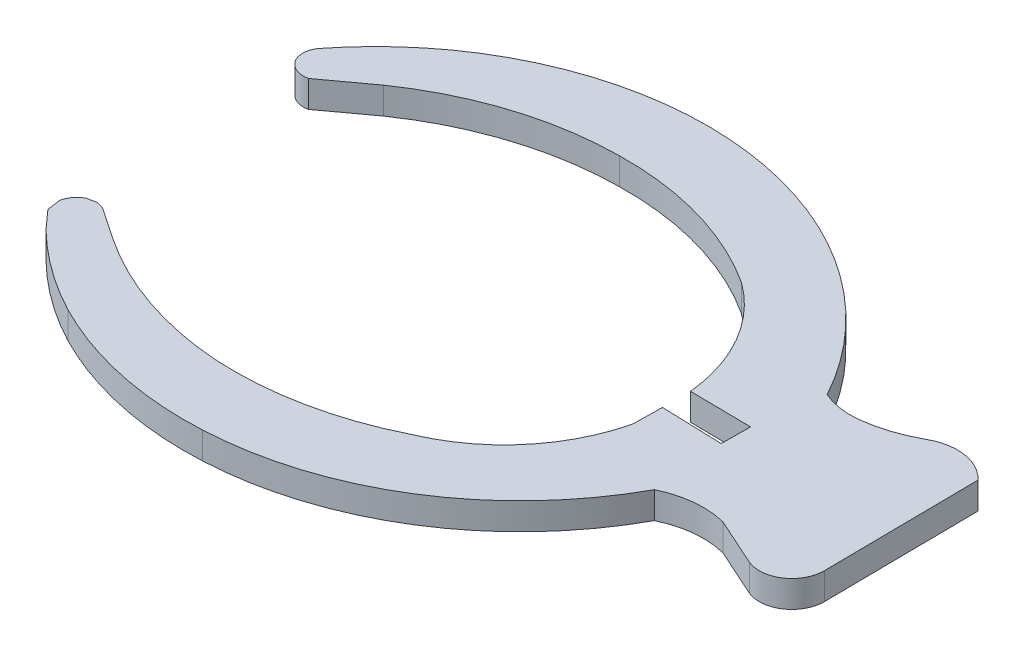
ISO-10303-21;
HEADER;
FILE_DESCRIPTION(('STEP AP214'),'2;1');
FILE_NAME('part.step','',(''),(''),'','','');
FILE_SCHEMA(('AUTOMOTIVE_DESIGN { 1 0 10303 214 1 1 1 1 }'));
ENDSEC;
DATA;
#1=APPLICATION_CONTEXT('core data for automotive mechanical design processes');
#2=APPLICATION_PROTOCOL_DEFINITION('international standard','automotive_design',2000,#1);
#3=PRODUCT_CONTEXT('',#1,'mechanical');
#4=PRODUCT('Part','Part','',(#3));
#5=PRODUCT_RELATED_PRODUCT_CATEGORY('part','',(#4));
#6=PRODUCT_DEFINITION_FORMATION('','',#4);
#7=PRODUCT_DEFINITION_CONTEXT('part definition',#1,'design');
#8=PRODUCT_DEFINITION('design','',#6,#7);
#9=PRODUCT_DEFINITION_SHAPE('','',#8);
#10=(LENGTH_UNIT() NAMED_UNIT(*) SI_UNIT(.MILLI.,.METRE.));
#11=(NAMED_UNIT(*) PLANE_ANGLE_UNIT() SI_UNIT($,.RADIAN.));
#12=(NAMED_UNIT(*) SI_UNIT($,.STERADIAN.) SOLID_ANGLE_UNIT());
#13=UNCERTAINTY_MEASURE_WITH_UNIT(LENGTH_MEASURE(1.E-05),#10,'distance_accuracy_value','');
#14=(GEOMETRIC_REPRESENTATION_CONTEXT(3) GLOBAL_UNCERTAINTY_ASSIGNED_CONTEXT((#13)) GLOBAL_UNIT_ASSIGNED_CONTEXT((#10,
#11,#12)) REPRESENTATION_CONTEXT('',''));
#15=CARTESIAN_POINT('',(0.,0.,0.));
#16=DIRECTION('',(0.,0.,1.));
#17=DIRECTION('',(1.,0.,0.));
#18=AXIS2_PLACEMENT_3D('',#15,#16,#17);
#19=CARTESIAN_POINT('',(-51.9580999999603,3.,14.1540000000221));
#20=DIRECTION('',(0.999847434216621,0.,0.0174673492677126));
#21=DIRECTION('',(0.0174673492677126,0.,-0.999847434216621));
#22=AXIS2_PLACEMENT_3D('',#19,#20,#21);
#23=PLANE('',#22);
#24=DIRECTION('',(-0.0174673492677126,0.,0.999847434216621));
#25=VECTOR('',#24,1.);
#26=CARTESIAN_POINT('',(-51.9580999999603,0.,14.1540000000221));
#27=LINE('',#26,#25);
#28=CARTESIAN_POINT('',(-51.90045,0.,10.85406));
#29=VERTEX_POINT('',#28);
#30=CARTESIAN_POINT('',(-51.9580999999603,0.,14.1540000000221));
#31=VERTEX_POINT('',#30);
#32=EDGE_CURVE('E275',#29,#31,#27,.T.);
#33=ORIENTED_EDGE('',*,*,#32,.T.);
#34=DIRECTION('',(0.,-1.,0.));
#35=VECTOR('',#34,1.);
#36=CARTESIAN_POINT('',(-51.9580999999603,3.,14.1540000000221));
#37=LINE('',#36,#35);
#38=CARTESIAN_POINT('',(-51.9580999999603,3.,14.1540000000221));
#39=VERTEX_POINT('',#38);
#40=EDGE_CURVE('E11',#39,#31,#37,.T.);
#41=ORIENTED_EDGE('',*,*,#40,.F.);
#42=DIRECTION('',(-0.0174673492677126,0.,0.999847434216621));
#43=VECTOR('',#42,1.);
#44=CARTESIAN_POINT('',(-51.9580999999603,3.,14.1540000000221));
#45=LINE('',#44,#43);
#46=CARTESIAN_POINT('',(-51.90045,3.,10.85406));
#47=VERTEX_POINT('',#46);
#48=EDGE_CURVE('E337',#47,#39,#45,.T.);
#49=ORIENTED_EDGE('',*,*,#48,.F.);
#50=DIRECTION('',(0.,-1.,0.));
#51=VECTOR('',#50,1.);
#52=CARTESIAN_POINT('',(-51.90045,3.,10.85406));
#53=LINE('',#52,#51);
#54=EDGE_CURVE('E271',#47,#29,#53,.T.);
#55=ORIENTED_EDGE('',*,*,#54,.T.);
#56=EDGE_LOOP('',(#33,#41,#49,#55));
#57=FACE_BOUND('',#56,.T.);
#58=ADVANCED_FACE('F35',(#57),#23,.F.);
#59=CARTESIAN_POINT('',(-70.9004116450741,3.,9.54715193339373));
#60=DIRECTION('',(0.,-1.,0.));
#61=DIRECTION('',(0.,0.,-1.));
#62=AXIS2_PLACEMENT_3D('',#59,#60,#61);
#63=CYLINDRICAL_SURFACE('',#62,19.4944663833);
#64=CARTESIAN_POINT('',(-70.9004116450741,0.,9.54715193339373));
#65=DIRECTION('',(0.,-1.,0.));
#66=DIRECTION('',(0.,0.,1.));
#67=AXIS2_PLACEMENT_3D('',#64,#65,#66);
#68=CIRCLE('',#67,19.4944663833);
#69=CARTESIAN_POINT('',(-63.3197400000056,0.,27.5073199999589));
#70=VERTEX_POINT('',#69);
#71=EDGE_CURVE('E278',#31,#70,#68,.T.);
#72=ORIENTED_EDGE('',*,*,#71,.T.);
#73=DIRECTION('',(0.,-1.,0.));
#74=VECTOR('',#73,1.);
#75=CARTESIAN_POINT('',(-63.3197400000056,3.,27.5073199999589));
#76=LINE('',#75,#74);
#77=CARTESIAN_POINT('',(-63.3197400000056,3.,27.5073199999589));
#78=VERTEX_POINT('',#77);
#79=EDGE_CURVE('E43',#78,#70,#76,.T.);
#80=ORIENTED_EDGE('',*,*,#79,.F.);
#81=CARTESIAN_POINT('',(-70.9004116450741,3.,9.54715193339373));
#82=DIRECTION('',(0.,-1.,0.));
#83=DIRECTION('',(0.,0.,1.));
#84=AXIS2_PLACEMENT_3D('',#81,#82,#83);
#85=CIRCLE('',#84,19.4944663833);
#86=EDGE_CURVE('E166',#39,#78,#85,.T.);
#87=ORIENTED_EDGE('',*,*,#86,.F.);
#88=ORIENTED_EDGE('',*,*,#40,.T.);
#89=EDGE_LOOP('',(#72,#80,#87,#88));
#90=FACE_BOUND('',#89,.T.);
#91=ADVANCED_FACE('F515',(#90),#63,.F.);
#92=CARTESIAN_POINT('',(-79.4016361748801,3.,-4.78266078530989));
#93=DIRECTION('',(0.,-1.,0.));
#94=DIRECTION('',(0.,0.,-1.));
#95=AXIS2_PLACEMENT_3D('',#92,#93,#94);
#96=CYLINDRICAL_SURFACE('',#95,36.0731235644);
#97=CARTESIAN_POINT('',(-79.4016361748801,0.,-4.78266078530989));
#98=DIRECTION('',(0.,-1.,0.));
#99=DIRECTION('',(0.,0.,1.));
#100=AXIS2_PLACEMENT_3D('',#97,#98,#99);
#101=CIRCLE('',#100,36.0731235644);
#102=CARTESIAN_POINT('',(-81.4610299999588,0.,31.2316299999562));
#103=VERTEX_POINT('',#102);
#104=EDGE_CURVE('E280',#70,#103,#101,.T.);
#105=ORIENTED_EDGE('',*,*,#104,.T.);
#106=DIRECTION('',(0.,-1.,0.));
#107=VECTOR('',#106,1.);
#108=CARTESIAN_POINT('',(-81.4610299999588,3.,31.2316299999562));
#109=LINE('',#108,#107);
#110=CARTESIAN_POINT('',(-81.4610299999588,3.,31.2316299999562));
#111=VERTEX_POINT('',#110);
#112=EDGE_CURVE('E416',#111,#103,#109,.T.);
#113=ORIENTED_EDGE('',*,*,#112,.F.);
#114=CARTESIAN_POINT('',(-79.4016361748801,3.,-4.78266078530989));
#115=DIRECTION('',(0.,-1.,0.));
#116=DIRECTION('',(0.,0.,1.));
#117=AXIS2_PLACEMENT_3D('',#114,#115,#116);
#118=CIRCLE('',#117,36.0731235644);
#119=EDGE_CURVE('E424',#78,#111,#118,.T.);
#120=ORIENTED_EDGE('',*,*,#119,.F.);
#121=ORIENTED_EDGE('',*,*,#79,.T.);
#122=EDGE_LOOP('',(#105,#113,#120,#121));
#123=FACE_BOUND('',#122,.T.);
#124=ADVANCED_FACE('F422',(#123),#96,.F.);
#125=CARTESIAN_POINT('',(-79.0103302841127,3.,-4.53637009720772));
#126=DIRECTION('',(0.,-1.,0.));
#127=DIRECTION('',(0.,0.,-1.));
#128=AXIS2_PLACEMENT_3D('',#125,#126,#127);
#129=CYLINDRICAL_SURFACE('',#128,35.8518585299);
#130=CARTESIAN_POINT('',(-79.0103302841127,0.,-4.53637009720772));
#131=DIRECTION('',(0.,-1.,0.));
#132=DIRECTION('',(0.,0.,1.));
#133=AXIS2_PLACEMENT_3D('',#130,#131,#132);
#134=CIRCLE('',#133,35.8518585299);
#135=CARTESIAN_POINT('',(-98.98063,0.,25.2385));
#136=VERTEX_POINT('',#135);
#137=EDGE_CURVE('E282',#103,#136,#134,.T.);
#138=ORIENTED_EDGE('',*,*,#137,.T.);
#139=DIRECTION('',(0.,-1.,0.));
#140=VECTOR('',#139,1.);
#141=CARTESIAN_POINT('',(-98.98063,3.,25.2385));
#142=LINE('',#141,#140);
#143=CARTESIAN_POINT('',(-98.98063,3.,25.2385));
#144=VERTEX_POINT('',#143);
#145=EDGE_CURVE('E413',#144,#136,#142,.T.);
#146=ORIENTED_EDGE('',*,*,#145,.F.);
#147=CARTESIAN_POINT('',(-79.0103302841127,3.,-4.53637009720772));
#148=DIRECTION('',(0.,-1.,0.));
#149=DIRECTION('',(0.,0.,1.));
#150=AXIS2_PLACEMENT_3D('',#147,#148,#149);
#151=CIRCLE('',#150,35.8518585299);
#152=EDGE_CURVE('E442',#111,#144,#151,.T.);
#153=ORIENTED_EDGE('',*,*,#152,.F.);
#154=ORIENTED_EDGE('',*,*,#112,.T.);
#155=EDGE_LOOP('',(#138,#146,#153,#154));
#156=FACE_BOUND('',#155,.T.);
#157=ADVANCED_FACE('F433',(#156),#129,.F.);
#158=CARTESIAN_POINT('',(-102.56647,3.,22.80769));
#159=DIRECTION('',(-0.561115925540942,0.,0.827737227690244));
#160=DIRECTION('',(0.827737227690244,0.,0.561115925540943));
#161=AXIS2_PLACEMENT_3D('',#158,#159,#160);
#162=PLANE('',#161);
#163=DIRECTION('',(-0.827737227690244,0.,-0.561115925540943));
#164=VECTOR('',#163,1.);
#165=CARTESIAN_POINT('',(-102.56647,0.,22.80769));
#166=LINE('',#165,#164);
#167=CARTESIAN_POINT('',(-102.56647,0.,22.80769));
#168=VERTEX_POINT('',#167);
#169=EDGE_CURVE('E284',#136,#168,#166,.T.);
#170=ORIENTED_EDGE('',*,*,#169,.T.);
#171=DIRECTION('',(0.,-1.,0.));
#172=VECTOR('',#171,1.);
#173=CARTESIAN_POINT('',(-102.56647,3.,22.80769));
#174=LINE('',#173,#172);
#175=CARTESIAN_POINT('',(-102.56647,3.,22.80769));
#176=VERTEX_POINT('',#175);
#177=EDGE_CURVE('E410',#176,#168,#174,.T.);
#178=ORIENTED_EDGE('',*,*,#177,.F.);
#179=DIRECTION('',(-0.827737227690244,0.,-0.561115925540943));
#180=VECTOR('',#179,1.);
#181=CARTESIAN_POINT('',(-102.56647,3.,22.80769));
#182=LINE('',#181,#180);
#183=EDGE_CURVE('E439',#144,#176,#182,.T.);
#184=ORIENTED_EDGE('',*,*,#183,.F.);
#185=ORIENTED_EDGE('',*,*,#145,.T.);
#186=EDGE_LOOP('',(#170,#178,#184,#185));
#187=FACE_BOUND('',#186,.T.);
#188=ADVANCED_FACE('F437',(#187),#162,.F.);
#189=CARTESIAN_POINT('',(-103.3295,3.,22.6015));
#190=DIRECTION('',(-0.260868554486898,0.,0.965374330133092));
#191=DIRECTION('',(0.965374330133092,0.,0.260868554486898));
#192=AXIS2_PLACEMENT_3D('',#189,#190,#191);
#193=PLANE('',#192);
#194=DIRECTION('',(-0.965374330133092,0.,-0.260868554486898));
#195=VECTOR('',#194,1.);
#196=CARTESIAN_POINT('',(-103.3295,0.,22.6015));
#197=LINE('',#196,#195);
#198=CARTESIAN_POINT('',(-103.3295,0.,22.6015));
#199=VERTEX_POINT('',#198);
#200=EDGE_CURVE('E286',#168,#199,#197,.T.);
#201=ORIENTED_EDGE('',*,*,#200,.T.);
#202=DIRECTION('',(0.,-1.,0.));
#203=VECTOR('',#202,1.);
#204=CARTESIAN_POINT('',(-103.3295,3.,22.6015));
#205=LINE('',#204,#203);
#206=CARTESIAN_POINT('',(-103.3295,3.,22.6015));
#207=VERTEX_POINT('',#206);
#208=EDGE_CURVE('E407',#207,#199,#205,.T.);
#209=ORIENTED_EDGE('',*,*,#208,.F.);
#210=DIRECTION('',(-0.965374330133092,0.,-0.260868554486898));
#211=VECTOR('',#210,1.);
#212=CARTESIAN_POINT('',(-103.3295,3.,22.6015));
#213=LINE('',#212,#211);
#214=EDGE_CURVE('E441',#176,#207,#213,.T.);
#215=ORIENTED_EDGE('',*,*,#214,.F.);
#216=ORIENTED_EDGE('',*,*,#177,.T.);
#217=EDGE_LOOP('',(#201,#209,#215,#216));
#218=FACE_BOUND('',#217,.T.);
#219=ADVANCED_FACE('F528',(#218),#193,.F.);
#220=CARTESIAN_POINT('',(-104.372630000001,3.,22.8076899999839));
#221=DIRECTION('',(0.193912800914444,0.,0.981018769260566));
#222=DIRECTION('',(0.981018769260566,0.,-0.193912800914444));
#223=AXIS2_PLACEMENT_3D('',#220,#221,#222);
#224=PLANE('',#223);
#225=DIRECTION('',(-0.981018769260566,0.,0.193912800914444));
#226=VECTOR('',#225,1.);
#227=CARTESIAN_POINT('',(-104.372630000001,0.,22.8076899999839));
#228=LINE('',#227,#226);
#229=CARTESIAN_POINT('',(-104.372630000001,0.,22.8076899999839));
#230=VERTEX_POINT('',#229);
#231=EDGE_CURVE('E288',#199,#230,#228,.T.);
#232=ORIENTED_EDGE('',*,*,#231,.T.);
#233=DIRECTION('',(0.,-1.,0.));
#234=VECTOR('',#233,1.);
#235=CARTESIAN_POINT('',(-104.372630000001,3.,22.8076899999839));
#236=LINE('',#235,#234);
#237=CARTESIAN_POINT('',(-104.372630000001,3.,22.8076899999839));
#238=VERTEX_POINT('',#237);
#239=EDGE_CURVE('E404',#238,#230,#236,.T.);
#240=ORIENTED_EDGE('',*,*,#239,.F.);
#241=DIRECTION('',(-0.981018769260566,0.,0.193912800914444));
#242=VECTOR('',#241,1.);
#243=CARTESIAN_POINT('',(-104.372630000001,3.,22.8076899999839));
#244=LINE('',#243,#242);
#245=EDGE_CURVE('E444',#207,#238,#244,.T.);
#246=ORIENTED_EDGE('',*,*,#245,.F.);
#247=ORIENTED_EDGE('',*,*,#208,.T.);
#248=EDGE_LOOP('',(#232,#240,#246,#247));
#249=FACE_BOUND('',#248,.T.);
#250=ADVANCED_FACE('F531',(#249),#224,.F.);
#251=CARTESIAN_POINT('',(-103.2003951898,3.,25.052396691));
#252=DIRECTION('',(0.,-1.,0.));
#253=DIRECTION('',(0.,0.,-1.));
#254=AXIS2_PLACEMENT_3D('',#251,#252,#253);
#255=CYLINDRICAL_SURFACE('',#254,2.5323590936);
#256=CARTESIAN_POINT('',(-103.2003951898,0.,25.052396691));
#257=DIRECTION('',(0.,1.,0.));
#258=DIRECTION('',(0.,0.,1.));
#259=AXIS2_PLACEMENT_3D('',#256,#257,#258);
#260=CIRCLE('',#259,2.5323590936);
#261=CARTESIAN_POINT('',(-105.666130000017,0.,24.475340000003));
#262=VERTEX_POINT('',#261);
#263=EDGE_CURVE('E290',#230,#262,#260,.T.);
#264=ORIENTED_EDGE('',*,*,#263,.T.);
#265=DIRECTION('',(0.,-1.,0.));
#266=VECTOR('',#265,1.);
#267=CARTESIAN_POINT('',(-105.666130000017,3.,24.475340000003));
#268=LINE('',#267,#266);
#269=CARTESIAN_POINT('',(-105.666130000017,3.,24.475340000003));
#270=VERTEX_POINT('',#269);
#271=EDGE_CURVE('E401',#270,#262,#268,.T.);
#272=ORIENTED_EDGE('',*,*,#271,.F.);
#273=CARTESIAN_POINT('',(-103.2003951898,3.,25.052396691));
#274=DIRECTION('',(0.,1.,0.));
#275=DIRECTION('',(0.,0.,1.));
#276=AXIS2_PLACEMENT_3D('',#273,#274,#275);
#277=CIRCLE('',#276,2.5323590936);
#278=EDGE_CURVE('E450',#238,#270,#277,.T.);
#279=ORIENTED_EDGE('',*,*,#278,.F.);
#280=ORIENTED_EDGE('',*,*,#239,.T.);
#281=EDGE_LOOP('',(#264,#272,#279,#280));
#282=FACE_BOUND('',#281,.T.);
#283=ADVANCED_FACE('F535',(#282),#255,.T.);
#284=CARTESIAN_POINT('',(-105.43629,3.,26.04881));
#285=DIRECTION('',(0.989499223059415,0.,-0.1445381872199));
#286=DIRECTION('',(-0.1445381872199,0.,-0.989499223059415));
#287=AXIS2_PLACEMENT_3D('',#284,#285,#286);
#288=PLANE('',#287);
#289=DIRECTION('',(0.1445381872199,0.,0.989499223059414));
#290=VECTOR('',#289,1.);
#291=CARTESIAN_POINT('',(-105.43629,0.,26.04881));
#292=LINE('',#291,#290);
#293=CARTESIAN_POINT('',(-105.43629,0.,26.04881));
#294=VERTEX_POINT('',#293);
#295=EDGE_CURVE('E292',#262,#294,#292,.T.);
#296=ORIENTED_EDGE('',*,*,#295,.T.);
#297=DIRECTION('',(0.,-1.,0.));
#298=VECTOR('',#297,1.);
#299=CARTESIAN_POINT('',(-105.43629,3.,26.04881));
#300=LINE('',#299,#298);
#301=CARTESIAN_POINT('',(-105.43629,3.,26.04881));
#302=VERTEX_POINT('',#301);
#303=EDGE_CURVE('E398',#302,#294,#300,.T.);
#304=ORIENTED_EDGE('',*,*,#303,.F.);
#305=DIRECTION('',(0.1445381872199,0.,0.989499223059414));
#306=VECTOR('',#305,1.);
#307=CARTESIAN_POINT('',(-105.43629,3.,26.04881));
#308=LINE('',#307,#306);
#309=EDGE_CURVE('E452',#270,#302,#308,.T.);
#310=ORIENTED_EDGE('',*,*,#309,.F.);
#311=ORIENTED_EDGE('',*,*,#271,.T.);
#312=EDGE_LOOP('',(#296,#304,#310,#311));
#313=FACE_BOUND('',#312,.T.);
#314=ADVANCED_FACE('F539',(#313),#288,.F.);
#315=CARTESIAN_POINT('',(-103.58598000004,3.,28.1083399999606));
#316=DIRECTION('',(0.743880603700861,0.,-0.668312537244096));
#317=DIRECTION('',(-0.668312537244097,0.,-0.743880603700862));
#318=AXIS2_PLACEMENT_3D('',#315,#316,#317);
#319=PLANE('',#318);
#320=DIRECTION('',(0.668312537244097,0.,0.743880603700862));
#321=VECTOR('',#320,1.);
#322=CARTESIAN_POINT('',(-103.58598000004,0.,28.1083399999606));
#323=LINE('',#322,#321);
#324=CARTESIAN_POINT('',(-103.58598000004,0.,28.1083399999606));
#325=VERTEX_POINT('',#324);
#326=EDGE_CURVE('E294',#294,#325,#323,.T.);
#327=ORIENTED_EDGE('',*,*,#326,.T.);
#328=DIRECTION('',(0.,-1.,0.));
#329=VECTOR('',#328,1.);
#330=CARTESIAN_POINT('',(-103.58598000004,3.,28.1083399999606));
#331=LINE('',#330,#329);
#332=CARTESIAN_POINT('',(-103.58598000004,3.,28.1083399999606));
#333=VERTEX_POINT('',#332);
#334=EDGE_CURVE('E395',#333,#325,#331,.T.);
#335=ORIENTED_EDGE('',*,*,#334,.F.);
#336=DIRECTION('',(0.668312537244097,0.,0.743880603700862));
#337=VECTOR('',#336,1.);
#338=CARTESIAN_POINT('',(-103.58598000004,3.,28.1083399999606));
#339=LINE('',#338,#337);
#340=EDGE_CURVE('E454',#302,#333,#339,.T.);
#341=ORIENTED_EDGE('',*,*,#340,.F.);
#342=ORIENTED_EDGE('',*,*,#303,.T.);
#343=EDGE_LOOP('',(#327,#335,#341,#342));
#344=FACE_BOUND('',#343,.T.);
#345=ADVANCED_FACE('F543',(#344),#319,.F.);
#346=CARTESIAN_POINT('',(-76.9473521839,3.,0.89417568));
#347=DIRECTION('',(0.,-1.,0.));
#348=DIRECTION('',(0.,0.,-1.));
#349=AXIS2_PLACEMENT_3D('',#346,#347,#348);
#350=CYLINDRICAL_SURFACE('',#349,38.081849109);
#351=CARTESIAN_POINT('',(-76.9473521839,0.,0.89417568));
#352=DIRECTION('',(0.,1.,0.));
#353=DIRECTION('',(0.,0.,1.));
#354=AXIS2_PLACEMENT_3D('',#351,#352,#353);
#355=CIRCLE('',#354,38.081849109);
#356=CARTESIAN_POINT('',(-94.6051600000434,0.,34.6347899999674));
#357=VERTEX_POINT('',#356);
#358=EDGE_CURVE('E296',#325,#357,#355,.T.);
#359=ORIENTED_EDGE('',*,*,#358,.T.);
#360=DIRECTION('',(0.,-1.,0.));
#361=VECTOR('',#360,1.);
#362=CARTESIAN_POINT('',(-94.6051600000434,3.,34.6347899999674));
#363=LINE('',#362,#361);
#364=CARTESIAN_POINT('',(-94.6051600000434,3.,34.6347899999674));
#365=VERTEX_POINT('',#364);
#366=EDGE_CURVE('E392',#365,#357,#363,.T.);
#367=ORIENTED_EDGE('',*,*,#366,.F.);
#368=CARTESIAN_POINT('',(-76.9473521839,3.,0.89417568));
#369=DIRECTION('',(0.,1.,0.));
#370=DIRECTION('',(0.,0.,1.));
#371=AXIS2_PLACEMENT_3D('',#368,#369,#370);
#372=CIRCLE('',#371,38.081849109);
#373=EDGE_CURVE('E456',#333,#365,#372,.T.);
#374=ORIENTED_EDGE('',*,*,#373,.F.);
#375=ORIENTED_EDGE('',*,*,#334,.T.);
#376=EDGE_LOOP('',(#359,#367,#374,#375));
#377=FACE_BOUND('',#376,.T.);
#378=ADVANCED_FACE('F547',(#377),#350,.T.);
#379=CARTESIAN_POINT('',(-77.3927458709575,3.,1.19167088780298));
#380=DIRECTION('',(0.,-1.,0.));
#381=DIRECTION('',(0.,0.,-1.));
#382=AXIS2_PLACEMENT_3D('',#379,#380,#381);
#383=CYLINDRICAL_SURFACE('',#382,37.6126230952);
#384=CARTESIAN_POINT('',(-77.3927458709575,0.,1.19167088780298));
#385=DIRECTION('',(0.,1.,0.));
#386=DIRECTION('',(0.,0.,1.));
#387=AXIS2_PLACEMENT_3D('',#384,#385,#386);
#388=CIRCLE('',#387,37.6126230952);
#389=CARTESIAN_POINT('',(-75.4473400000311,0.,38.7539499999513));
#390=VERTEX_POINT('',#389);
#391=EDGE_CURVE('E298',#357,#390,#388,.T.);
#392=ORIENTED_EDGE('',*,*,#391,.T.);
#393=DIRECTION('',(0.,-1.,0.));
#394=VECTOR('',#393,1.);
#395=CARTESIAN_POINT('',(-75.4473400000311,3.,38.7539499999513));
#396=LINE('',#395,#394);
#397=CARTESIAN_POINT('',(-75.4473400000311,3.,38.7539499999513));
#398=VERTEX_POINT('',#397);
#399=EDGE_CURVE('E389',#398,#390,#396,.T.);
#400=ORIENTED_EDGE('',*,*,#399,.F.);
#401=CARTESIAN_POINT('',(-77.3927458709575,3.,1.19167088780298));
#402=DIRECTION('',(0.,1.,0.));
#403=DIRECTION('',(0.,0.,1.));
#404=AXIS2_PLACEMENT_3D('',#401,#402,#403);
#405=CIRCLE('',#404,37.6126230952);
#406=EDGE_CURVE('E458',#365,#398,#405,.T.);
#407=ORIENTED_EDGE('',*,*,#406,.F.);
#408=ORIENTED_EDGE('',*,*,#366,.T.);
#409=EDGE_LOOP('',(#392,#400,#407,#408));
#410=FACE_BOUND('',#409,.T.);
#411=ADVANCED_FACE('F551',(#410),#383,.T.);
#412=CARTESIAN_POINT('',(-77.242766420989,3.,1.40131775449898));
#413=DIRECTION('',(0.,-1.,0.));
#414=DIRECTION('',(0.,0.,-1.));
#415=AXIS2_PLACEMENT_3D('',#412,#413,#414);
#416=CYLINDRICAL_SURFACE('',#415,37.3957576697823);
#417=CARTESIAN_POINT('',(-77.242766420989,0.,1.40131775449898));
#418=DIRECTION('',(0.,1.,0.));
#419=DIRECTION('',(0.,0.,1.));
#420=AXIS2_PLACEMENT_3D('',#417,#418,#419);
#421=CIRCLE('',#420,37.3957576697823);
#422=CARTESIAN_POINT('',(-44.3917600000067,0.,19.2689999999851));
#423=VERTEX_POINT('',#422);
#424=EDGE_CURVE('E300',#390,#423,#421,.T.);
#425=ORIENTED_EDGE('',*,*,#424,.T.);
#426=DIRECTION('',(0.,-1.,0.));
#427=VECTOR('',#426,1.);
#428=CARTESIAN_POINT('',(-44.3917600000067,3.,19.2689999999851));
#429=LINE('',#428,#427);
#430=CARTESIAN_POINT('',(-44.3917600000067,3.,19.2689999999851));
#431=VERTEX_POINT('',#430);
#432=EDGE_CURVE('E386',#431,#423,#429,.T.);
#433=ORIENTED_EDGE('',*,*,#432,.F.);
#434=CARTESIAN_POINT('',(-77.242766420989,3.,1.40131775449898));
#435=DIRECTION('',(0.,1.,0.));
#436=DIRECTION('',(0.,0.,1.));
#437=AXIS2_PLACEMENT_3D('',#434,#435,#436);
#438=CIRCLE('',#437,37.3957576697823);
#439=EDGE_CURVE('E460',#398,#431,#438,.T.);
#440=ORIENTED_EDGE('',*,*,#439,.F.);
#441=ORIENTED_EDGE('',*,*,#399,.T.);
#442=EDGE_LOOP('',(#425,#433,#440,#441));
#443=FACE_BOUND('',#442,.T.);
#444=ADVANCED_FACE('F555',(#443),#416,.T.);
#445=CARTESIAN_POINT('',(-39.9357485850212,3.,28.4204798534445));
#446=DIRECTION('',(0.,-1.,0.));
#447=DIRECTION('',(0.,0.,-1.));
#448=AXIS2_PLACEMENT_3D('',#445,#446,#447);
#449=CYLINDRICAL_SURFACE('',#448,10.1786846517);
#450=CARTESIAN_POINT('',(-39.9357485850212,0.,28.4204798534445));
#451=DIRECTION('',(0.,-1.,0.));
#452=DIRECTION('',(0.,0.,1.));
#453=AXIS2_PLACEMENT_3D('',#450,#451,#452);
#454=CIRCLE('',#453,10.1786846517);
#455=CARTESIAN_POINT('',(-37.4498199999836,0.,18.5500300000261));
#456=VERTEX_POINT('',#455);
#457=EDGE_CURVE('E302',#423,#456,#454,.T.);
#458=ORIENTED_EDGE('',*,*,#457,.T.);
#459=DIRECTION('',(0.,-1.,0.));
#460=VECTOR('',#459,1.);
#461=CARTESIAN_POINT('',(-37.4498199999836,3.,18.5500300000261));
#462=LINE('',#461,#460);
#463=CARTESIAN_POINT('',(-37.4498199999836,3.,18.5500300000261));
#464=VERTEX_POINT('',#463);
#465=EDGE_CURVE('E383',#464,#456,#462,.T.);
#466=ORIENTED_EDGE('',*,*,#465,.F.);
#467=CARTESIAN_POINT('',(-39.9357485850212,3.,28.4204798534445));
#468=DIRECTION('',(0.,-1.,0.));
#469=DIRECTION('',(0.,0.,1.));
#470=AXIS2_PLACEMENT_3D('',#467,#468,#469);
#471=CIRCLE('',#470,10.1786846517);
#472=EDGE_CURVE('E462',#431,#464,#471,.T.);
#473=ORIENTED_EDGE('',*,*,#472,.F.);
#474=ORIENTED_EDGE('',*,*,#432,.T.);
#475=EDGE_LOOP('',(#458,#466,#473,#474));
#476=FACE_BOUND('',#475,.T.);
#477=ADVANCED_FACE('F559',(#476),#449,.F.);
#478=CARTESIAN_POINT('',(-32.0578200000054,3.,20.9808399999921));
#479=DIRECTION('',(0.410984634412334,0.,-0.911642271001603));
#480=DIRECTION('',(-0.911642271001603,0.,-0.410984634412334));
#481=AXIS2_PLACEMENT_3D('',#478,#479,#480);
#482=PLANE('',#481);
#483=DIRECTION('',(0.911642271001603,0.,0.410984634412334));
#484=VECTOR('',#483,1.);
#485=CARTESIAN_POINT('',(-32.0578200000054,0.,20.9808399999921));
#486=LINE('',#485,#484);
#487=CARTESIAN_POINT('',(-32.0578200000054,0.,20.9808399999921));
#488=VERTEX_POINT('',#487);
#489=EDGE_CURVE('E304',#456,#488,#486,.T.);
#490=ORIENTED_EDGE('',*,*,#489,.T.);
#491=DIRECTION('',(0.,-1.,0.));
#492=VECTOR('',#491,1.);
#493=CARTESIAN_POINT('',(-32.0578200000054,3.,20.9808399999921));
#494=LINE('',#493,#492);
#495=CARTESIAN_POINT('',(-32.0578200000054,3.,20.9808399999921));
#496=VERTEX_POINT('',#495);
#497=EDGE_CURVE('E380',#496,#488,#494,.T.);
#498=ORIENTED_EDGE('',*,*,#497,.F.);
#499=DIRECTION('',(0.911642271001603,0.,0.410984634412334));
#500=VECTOR('',#499,1.);
#501=CARTESIAN_POINT('',(-32.0578200000054,3.,20.9808399999921));
#502=LINE('',#501,#500);
#503=EDGE_CURVE('E464',#464,#496,#502,.T.);
#504=ORIENTED_EDGE('',*,*,#503,.F.);
#505=ORIENTED_EDGE('',*,*,#465,.T.);
#506=EDGE_LOOP('',(#490,#498,#504,#505));
#507=FACE_BOUND('',#506,.T.);
#508=ADVANCED_FACE('F563',(#507),#482,.F.);
#509=CARTESIAN_POINT('',(-30.6691583876654,3.,17.6243389081067));
#510=DIRECTION('',(0.,-1.,0.));
#511=DIRECTION('',(0.,0.,-1.));
#512=AXIS2_PLACEMENT_3D('',#509,#510,#511);
#513=CYLINDRICAL_SURFACE('',#512,3.63242077042496);
#514=CARTESIAN_POINT('',(-30.6691583876654,0.,17.6243389081067));
#515=DIRECTION('',(0.,1.,0.));
#516=DIRECTION('',(0.,0.,1.));
#517=AXIS2_PLACEMENT_3D('',#514,#515,#516);
#518=CIRCLE('',#517,3.63242077042496);
#519=CARTESIAN_POINT('',(-27.0369999999909,0.,17.5806799999634));
#520=VERTEX_POINT('',#519);
#521=EDGE_CURVE('E306',#488,#520,#518,.T.);
#522=ORIENTED_EDGE('',*,*,#521,.T.);
#523=DIRECTION('',(0.,-1.,0.));
#524=VECTOR('',#523,1.);
#525=CARTESIAN_POINT('',(-27.0369999999909,3.,17.5806799999634));
#526=LINE('',#525,#524);
#527=CARTESIAN_POINT('',(-27.0369999999909,3.,17.5806799999634));
#528=VERTEX_POINT('',#527);
#529=EDGE_CURVE('E377',#528,#520,#526,.T.);
#530=ORIENTED_EDGE('',*,*,#529,.F.);
#531=CARTESIAN_POINT('',(-30.6691583876654,3.,17.6243389081067));
#532=DIRECTION('',(0.,1.,0.));
#533=DIRECTION('',(0.,0.,1.));
#534=AXIS2_PLACEMENT_3D('',#531,#532,#533);
#535=CIRCLE('',#534,3.63242077042496);
#536=EDGE_CURVE('E466',#496,#528,#535,.T.);
#537=ORIENTED_EDGE('',*,*,#536,.F.);
#538=ORIENTED_EDGE('',*,*,#497,.T.);
#539=EDGE_LOOP('',(#522,#530,#537,#538));
#540=FACE_BOUND('',#539,.T.);
#541=ADVANCED_FACE('F567',(#540),#513,.T.);
#542=CARTESIAN_POINT('',(-27.22278999998,3.,0.246839999965637));
#543=DIRECTION('',(-0.999942563536832,0.,0.0107177249166163));
#544=DIRECTION('',(0.0107177249166163,0.,0.999942563536832));
#545=AXIS2_PLACEMENT_3D('',#542,#543,#544);
#546=PLANE('',#545);
#547=DIRECTION('',(-0.0107177249166163,0.,-0.999942563536832));
#548=VECTOR('',#547,1.);
#549=CARTESIAN_POINT('',(-27.22278999998,0.,0.246839999965637));
#550=LINE('',#549,#548);
#551=CARTESIAN_POINT('',(-27.22278999998,0.,0.246839999965638));
#552=VERTEX_POINT('',#551);
#553=EDGE_CURVE('E308',#520,#552,#550,.T.);
#554=ORIENTED_EDGE('',*,*,#553,.T.);
#555=DIRECTION('',(0.,-1.,0.));
#556=VECTOR('',#555,1.);
#557=CARTESIAN_POINT('',(-27.22278999998,3.,0.246839999965638));
#558=LINE('',#557,#556);
#559=CARTESIAN_POINT('',(-27.22278999998,3.,0.246839999965638));
#560=VERTEX_POINT('',#559);
#561=EDGE_CURVE('E374',#560,#552,#558,.T.);
#562=ORIENTED_EDGE('',*,*,#561,.F.);
#563=DIRECTION('',(-0.0107177249166163,0.,-0.999942563536832));
#564=VECTOR('',#563,1.);
#565=CARTESIAN_POINT('',(-27.22278999998,3.,0.246839999965637));
#566=LINE('',#565,#564);
#567=EDGE_CURVE('E468',#528,#560,#566,.T.);
#568=ORIENTED_EDGE('',*,*,#567,.F.);
#569=ORIENTED_EDGE('',*,*,#529,.T.);
#570=EDGE_LOOP('',(#554,#562,#568,#569));
#571=FACE_BOUND('',#570,.T.);
#572=ADVANCED_FACE('F571',(#571),#546,.F.);
#573=CARTESIAN_POINT('',(-31.3000741029011,3.,4.03667935847291));
#574=DIRECTION('',(0.,-1.,0.));
#575=DIRECTION('',(0.,0.,-1.));
#576=AXIS2_PLACEMENT_3D('',#573,#574,#575);
#577=CYLINDRICAL_SURFACE('',#576,5.56660830481402);
#578=CARTESIAN_POINT('',(-31.3000741029011,0.,4.03667935847291));
#579=DIRECTION('',(0.,1.,0.));
#580=DIRECTION('',(0.,0.,1.));
#581=AXIS2_PLACEMENT_3D('',#578,#579,#580);
#582=CIRCLE('',#581,5.56660830481402);
#583=CARTESIAN_POINT('',(-34.0260000000002,0.,-0.816820000005391));
#584=VERTEX_POINT('',#583);
#585=EDGE_CURVE('E310',#552,#584,#582,.T.);
#586=ORIENTED_EDGE('',*,*,#585,.T.);
#587=DIRECTION('',(0.,-1.,0.));
#588=VECTOR('',#587,1.);
#589=CARTESIAN_POINT('',(-34.0260000000002,3.,-0.816820000005391));
#590=LINE('',#589,#588);
#591=CARTESIAN_POINT('',(-34.0260000000002,3.,-0.816820000005391));
#592=VERTEX_POINT('',#591);
#593=EDGE_CURVE('E371',#592,#584,#590,.T.);
#594=ORIENTED_EDGE('',*,*,#593,.F.);
#595=CARTESIAN_POINT('',(-31.3000741029011,3.,4.03667935847291));
#596=DIRECTION('',(0.,1.,0.));
#597=DIRECTION('',(0.,0.,1.));
#598=AXIS2_PLACEMENT_3D('',#595,#596,#597);
#599=CIRCLE('',#598,5.56660830481402);
#600=EDGE_CURVE('E470',#560,#592,#599,.T.);
#601=ORIENTED_EDGE('',*,*,#600,.F.);
#602=ORIENTED_EDGE('',*,*,#561,.T.);
#603=EDGE_LOOP('',(#586,#594,#601,#602));
#604=FACE_BOUND('',#603,.T.);
#605=ADVANCED_FACE('F575',(#604),#577,.T.);
#606=CARTESIAN_POINT('',(-41.6083398119264,3.,-14.422913658497));
#607=DIRECTION('',(0.,-1.,0.));
#608=DIRECTION('',(0.,0.,-1.));
#609=AXIS2_PLACEMENT_3D('',#606,#607,#608);
#610=CYLINDRICAL_SURFACE('',#609,15.5761889327);
#611=CARTESIAN_POINT('',(-41.6083398119264,0.,-14.422913658497));
#612=DIRECTION('',(0.,-1.,0.));
#613=DIRECTION('',(0.,0.,1.));
#614=AXIS2_PLACEMENT_3D('',#611,#612,#613);
#615=CIRCLE('',#614,15.5761889327);
#616=CARTESIAN_POINT('',(-39.8806299999927,0.,1.05716000001363));
#617=VERTEX_POINT('',#616);
#618=EDGE_CURVE('E312',#584,#617,#615,.T.);
#619=ORIENTED_EDGE('',*,*,#618,.T.);
#620=DIRECTION('',(0.,-1.,0.));
#621=VECTOR('',#620,1.);
#622=CARTESIAN_POINT('',(-39.8806299999927,3.,1.05716000001363));
#623=LINE('',#622,#621);
#624=CARTESIAN_POINT('',(-39.8806299999927,3.,1.05716000001363));
#625=VERTEX_POINT('',#624);
#626=EDGE_CURVE('E368',#625,#617,#623,.T.);
#627=ORIENTED_EDGE('',*,*,#626,.F.);
#628=CARTESIAN_POINT('',(-41.6083398119264,3.,-14.422913658497));
#629=DIRECTION('',(0.,-1.,0.));
#630=DIRECTION('',(0.,0.,1.));
#631=AXIS2_PLACEMENT_3D('',#628,#629,#630);
#632=CIRCLE('',#631,15.5761889327);
#633=EDGE_CURVE('E472',#592,#625,#632,.T.);
#634=ORIENTED_EDGE('',*,*,#633,.F.);
#635=ORIENTED_EDGE('',*,*,#593,.T.);
#636=EDGE_LOOP('',(#619,#627,#634,#635));
#637=FACE_BOUND('',#636,.T.);
#638=ADVANCED_FACE('F579',(#637),#610,.F.);
#639=CARTESIAN_POINT('',(-40.6259690908339,3.,-7.25282825302029));
#640=DIRECTION('',(0.,-1.,0.));
#641=DIRECTION('',(0.,0.,-1.));
#642=AXIS2_PLACEMENT_3D('',#639,#640,#641);
#643=CYLINDRICAL_SURFACE('',#642,8.3433467581);
#644=CARTESIAN_POINT('',(-40.6259690908339,0.,-7.25282825302029));
#645=DIRECTION('',(0.,-1.,0.));
#646=DIRECTION('',(0.,0.,1.));
#647=AXIS2_PLACEMENT_3D('',#644,#645,#646);
#648=CIRCLE('',#647,8.3433467581);
#649=CARTESIAN_POINT('',(-43.9289699999899,0.,0.408869999979002));
#650=VERTEX_POINT('',#649);
#651=EDGE_CURVE('E314',#617,#650,#648,.T.);
#652=ORIENTED_EDGE('',*,*,#651,.T.);
#653=DIRECTION('',(0.,-1.,0.));
#654=VECTOR('',#653,1.);
#655=CARTESIAN_POINT('',(-43.9289699999899,3.,0.408869999979002));
#656=LINE('',#655,#654);
#657=CARTESIAN_POINT('',(-43.9289699999899,3.,0.408869999979002));
#658=VERTEX_POINT('',#657);
#659=EDGE_CURVE('E365',#658,#650,#656,.T.);
#660=ORIENTED_EDGE('',*,*,#659,.F.);
#661=CARTESIAN_POINT('',(-40.6259690908339,3.,-7.25282825302029));
#662=DIRECTION('',(0.,-1.,0.));
#663=DIRECTION('',(0.,0.,1.));
#664=AXIS2_PLACEMENT_3D('',#661,#662,#663);
#665=CIRCLE('',#664,8.3433467581);
#666=EDGE_CURVE('E474',#625,#658,#665,.T.);
#667=ORIENTED_EDGE('',*,*,#666,.F.);
#668=ORIENTED_EDGE('',*,*,#626,.T.);
#669=EDGE_LOOP('',(#652,#660,#667,#668));
#670=FACE_BOUND('',#669,.T.);
#671=ADVANCED_FACE('F583',(#670),#643,.F.);
#672=CARTESIAN_POINT('',(-76.6471246835943,3.,18.3755829442851));
#673=DIRECTION('',(0.,-1.,0.));
#674=DIRECTION('',(0.,0.,-1.));
#675=AXIS2_PLACEMENT_3D('',#672,#673,#674);
#676=CYLINDRICAL_SURFACE('',#675,37.3266716963);
#677=CARTESIAN_POINT('',(-76.6471246835943,0.,18.3755829442851));
#678=DIRECTION('',(0.,1.,0.));
#679=DIRECTION('',(0.,0.,1.));
#680=AXIS2_PLACEMENT_3D('',#677,#678,#679);
#681=CIRCLE('',#680,37.3266716963);
#682=CARTESIAN_POINT('',(-78.7767100000082,0.,-18.890290000052));
#683=VERTEX_POINT('',#682);
#684=EDGE_CURVE('E316',#650,#683,#681,.T.);
#685=ORIENTED_EDGE('',*,*,#684,.T.);
#686=DIRECTION('',(0.,-1.,0.));
#687=VECTOR('',#686,1.);
#688=CARTESIAN_POINT('',(-78.7767100000082,3.,-18.890290000052));
#689=LINE('',#688,#687);
#690=CARTESIAN_POINT('',(-78.7767100000082,3.,-18.890290000052));
#691=VERTEX_POINT('',#690);
#692=EDGE_CURVE('E362',#691,#683,#689,.T.);
#693=ORIENTED_EDGE('',*,*,#692,.F.);
#694=CARTESIAN_POINT('',(-76.6471246835943,3.,18.3755829442851));
#695=DIRECTION('',(0.,1.,0.));
#696=DIRECTION('',(0.,0.,1.));
#697=AXIS2_PLACEMENT_3D('',#694,#695,#696);
#698=CIRCLE('',#697,37.3266716963);
#699=EDGE_CURVE('E476',#658,#691,#698,.T.);
#700=ORIENTED_EDGE('',*,*,#699,.F.);
#701=ORIENTED_EDGE('',*,*,#659,.T.);
#702=EDGE_LOOP('',(#685,#693,#700,#701));
#703=FACE_BOUND('',#702,.T.);
#704=ADVANCED_FACE('F587',(#703),#676,.T.);
#705=CARTESIAN_POINT('',(-76.5845092858859,3.,18.3010561966791));
#706=DIRECTION('',(0.,-1.,0.));
#707=DIRECTION('',(0.,0.,-1.));
#708=AXIS2_PLACEMENT_3D('',#705,#706,#707);
#709=CYLINDRICAL_SURFACE('',#708,37.2558985383);
#710=CARTESIAN_POINT('',(-76.5845092858859,0.,18.3010561966791));
#711=DIRECTION('',(0.,1.,0.));
#712=DIRECTION('',(0.,0.,1.));
#713=AXIS2_PLACEMENT_3D('',#710,#711,#712);
#714=CIRCLE('',#713,37.2558985383);
#715=CARTESIAN_POINT('',(-98.3323399999931,0.,-11.9484700000507));
#716=VERTEX_POINT('',#715);
#717=EDGE_CURVE('E318',#683,#716,#714,.T.);
#718=ORIENTED_EDGE('',*,*,#717,.T.);
#719=DIRECTION('',(0.,-1.,0.));
#720=VECTOR('',#719,1.);
#721=CARTESIAN_POINT('',(-98.3323399999931,3.,-11.9484700000507));
#722=LINE('',#721,#720);
#723=CARTESIAN_POINT('',(-98.3323399999931,3.,-11.9484700000507));
#724=VERTEX_POINT('',#723);
#725=EDGE_CURVE('E359',#724,#716,#722,.T.);
#726=ORIENTED_EDGE('',*,*,#725,.F.);
#727=CARTESIAN_POINT('',(-76.5845092858859,3.,18.3010561966791));
#728=DIRECTION('',(0.,1.,0.));
#729=DIRECTION('',(0.,0.,1.));
#730=AXIS2_PLACEMENT_3D('',#727,#728,#729);
#731=CIRCLE('',#730,37.2558985383);
#732=EDGE_CURVE('E478',#691,#724,#731,.T.);
#733=ORIENTED_EDGE('',*,*,#732,.F.);
#734=ORIENTED_EDGE('',*,*,#692,.T.);
#735=EDGE_LOOP('',(#718,#726,#733,#734));
#736=FACE_BOUND('',#735,.T.);
#737=ADVANCED_FACE('F591',(#736),#709,.T.);
#738=CARTESIAN_POINT('',(-76.1595760983428,3.,18.6847654627197));
#739=DIRECTION('',(0.,-1.,0.));
#740=DIRECTION('',(0.,0.,-1.));
#741=AXIS2_PLACEMENT_3D('',#738,#739,#740);
#742=CYLINDRICAL_SURFACE('',#741,37.8156921655);
#743=CARTESIAN_POINT('',(-76.1595760983428,0.,18.6847654627197));
#744=DIRECTION('',(0.,1.,0.));
#745=DIRECTION('',(0.,0.,1.));
#746=AXIS2_PLACEMENT_3D('',#743,#744,#745);
#747=CIRCLE('',#746,37.8156921655);
#748=CARTESIAN_POINT('',(-105.875319999964,0.,-4.70329000003931));
#749=VERTEX_POINT('',#748);
#750=EDGE_CURVE('E320',#716,#749,#747,.T.);
#751=ORIENTED_EDGE('',*,*,#750,.T.);
#752=DIRECTION('',(0.,-1.,0.));
#753=VECTOR('',#752,1.);
#754=CARTESIAN_POINT('',(-105.875319999964,3.,-4.70329000003931));
#755=LINE('',#754,#753);
#756=CARTESIAN_POINT('',(-105.875319999964,3.,-4.70329000003931));
#757=VERTEX_POINT('',#756);
#758=EDGE_CURVE('E356',#757,#749,#755,.T.);
#759=ORIENTED_EDGE('',*,*,#758,.F.);
#760=CARTESIAN_POINT('',(-76.1595760983428,3.,18.6847654627197));
#761=DIRECTION('',(0.,1.,0.));
#762=DIRECTION('',(0.,0.,1.));
#763=AXIS2_PLACEMENT_3D('',#760,#761,#762);
#764=CIRCLE('',#763,37.8156921655);
#765=EDGE_CURVE('E480',#724,#757,#764,.T.);
#766=ORIENTED_EDGE('',*,*,#765,.F.);
#767=ORIENTED_EDGE('',*,*,#725,.T.);
#768=EDGE_LOOP('',(#751,#759,#766,#767));
#769=FACE_BOUND('',#768,.T.);
#770=ADVANCED_FACE('F595',(#769),#742,.T.);
#771=CARTESIAN_POINT('',(-104.067440005796,3.,-3.35410983781808));
#772=DIRECTION('',(0.,-1.,0.));
#773=DIRECTION('',(0.,0.,-1.));
#774=AXIS2_PLACEMENT_3D('',#771,#772,#773);
#775=CYLINDRICAL_SURFACE('',#774,2.25581851739999);
#776=CARTESIAN_POINT('',(-104.067440005796,0.,-3.35410983781808));
#777=DIRECTION('',(0.,1.,0.));
#778=DIRECTION('',(0.,0.,1.));
#779=AXIS2_PLACEMENT_3D('',#776,#777,#778);
#780=CIRCLE('',#779,2.25581851739999);
#781=CARTESIAN_POINT('',(-105.966630000015,0.,-2.1368199999796));
#782=VERTEX_POINT('',#781);
#783=EDGE_CURVE('E322',#749,#782,#780,.T.);
#784=ORIENTED_EDGE('',*,*,#783,.T.);
#785=DIRECTION('',(0.,-1.,0.));
#786=VECTOR('',#785,1.);
#787=CARTESIAN_POINT('',(-105.966630000015,3.,-2.1368199999796));
#788=LINE('',#787,#786);
#789=CARTESIAN_POINT('',(-105.966630000015,3.,-2.1368199999796));
#790=VERTEX_POINT('',#789);
#791=EDGE_CURVE('E353',#790,#782,#788,.T.);
#792=ORIENTED_EDGE('',*,*,#791,.F.);
#793=CARTESIAN_POINT('',(-104.067440005796,3.,-3.35410983781808));
#794=DIRECTION('',(0.,1.,0.));
#795=DIRECTION('',(0.,0.,1.));
#796=AXIS2_PLACEMENT_3D('',#793,#794,#795);
#797=CIRCLE('',#796,2.25581851739999);
#798=EDGE_CURVE('E482',#757,#790,#797,.T.);
#799=ORIENTED_EDGE('',*,*,#798,.F.);
#800=ORIENTED_EDGE('',*,*,#758,.T.);
#801=EDGE_LOOP('',(#784,#792,#799,#800));
#802=FACE_BOUND('',#801,.T.);
#803=ADVANCED_FACE('F599',(#802),#775,.T.);
#804=CARTESIAN_POINT('',(-104.062732710073,3.,-3.49793104279385));
#805=DIRECTION('',(0.,-1.,0.));
#806=DIRECTION('',(0.,0.,-1.));
#807=AXIS2_PLACEMENT_3D('',#804,#805,#806);
#808=CYLINDRICAL_SURFACE('',#807,2.34039487299046);
#809=CARTESIAN_POINT('',(-104.062732710073,0.,-3.49793104279385));
#810=DIRECTION('',(0.,1.,0.));
#811=DIRECTION('',(0.,0.,1.));
#812=AXIS2_PLACEMENT_3D('',#809,#810,#811);
#813=CIRCLE('',#812,2.34039487299046);
#814=CARTESIAN_POINT('',(-103.56232,0.,-1.21166));
#815=VERTEX_POINT('',#814);
#816=EDGE_CURVE('E324',#782,#815,#813,.T.);
#817=ORIENTED_EDGE('',*,*,#816,.T.);
#818=DIRECTION('',(0.,-1.,0.));
#819=VECTOR('',#818,1.);
#820=CARTESIAN_POINT('',(-103.56232,3.,-1.21166));
#821=LINE('',#820,#819);
#822=CARTESIAN_POINT('',(-103.56232,3.,-1.21166));
#823=VERTEX_POINT('',#822);
#824=EDGE_CURVE('E350',#823,#815,#821,.T.);
#825=ORIENTED_EDGE('',*,*,#824,.F.);
#826=CARTESIAN_POINT('',(-104.062732710073,3.,-3.49793104279385));
#827=DIRECTION('',(0.,1.,0.));
#828=DIRECTION('',(0.,0.,1.));
#829=AXIS2_PLACEMENT_3D('',#826,#827,#828);
#830=CIRCLE('',#829,2.34039487299046);
#831=EDGE_CURVE('E484',#790,#823,#830,.T.);
#832=ORIENTED_EDGE('',*,*,#831,.F.);
#833=ORIENTED_EDGE('',*,*,#791,.T.);
#834=EDGE_LOOP('',(#817,#825,#832,#833));
#835=FACE_BOUND('',#834,.T.);
#836=ADVANCED_FACE('F603',(#835),#808,.T.);
#837=CARTESIAN_POINT('',(-98.7006600000202,3.,-4.77380999994523));
#838=DIRECTION('',(-0.591032660554957,0.,-0.806647627007809));
#839=DIRECTION('',(-0.806647627007809,0.,0.591032660554957));
#840=AXIS2_PLACEMENT_3D('',#837,#838,#839);
#841=PLANE('',#840);
#842=DIRECTION('',(0.806647627007809,0.,-0.591032660554957));
#843=VECTOR('',#842,1.);
#844=CARTESIAN_POINT('',(-98.7006600000202,0.,-4.77380999994523));
#845=LINE('',#844,#843);
#846=CARTESIAN_POINT('',(-98.7006600000202,0.,-4.77380999994524));
#847=VERTEX_POINT('',#846);
#848=EDGE_CURVE('E326',#815,#847,#845,.T.);
#849=ORIENTED_EDGE('',*,*,#848,.T.);
#850=DIRECTION('',(0.,-1.,0.));
#851=VECTOR('',#850,1.);
#852=CARTESIAN_POINT('',(-98.7006600000202,3.,-4.77380999994524));
#853=LINE('',#852,#851);
#854=CARTESIAN_POINT('',(-98.7006600000202,3.,-4.77380999994524));
#855=VERTEX_POINT('',#854);
#856=EDGE_CURVE('E347',#855,#847,#853,.T.);
#857=ORIENTED_EDGE('',*,*,#856,.F.);
#858=DIRECTION('',(0.806647627007809,0.,-0.591032660554957));
#859=VECTOR('',#858,1.);
#860=CARTESIAN_POINT('',(-98.7006600000202,3.,-4.77380999994523));
#861=LINE('',#860,#859);
#862=EDGE_CURVE('E486',#823,#855,#861,.T.);
#863=ORIENTED_EDGE('',*,*,#862,.F.);
#864=ORIENTED_EDGE('',*,*,#824,.T.);
#865=EDGE_LOOP('',(#849,#857,#863,#864));
#866=FACE_BOUND('',#865,.T.);
#867=ADVANCED_FACE('F607',(#866),#841,.F.);
#868=CARTESIAN_POINT('',(-78.3738823907575,3.,24.6289207573706));
#869=DIRECTION('',(0.,-1.,0.));
#870=DIRECTION('',(0.,0.,-1.));
#871=AXIS2_PLACEMENT_3D('',#868,#869,#870);
#872=CYLINDRICAL_SURFACE('',#871,35.7449082243);
#873=CARTESIAN_POINT('',(-78.3738823907575,0.,24.6289207573706));
#874=DIRECTION('',(0.,-1.,0.));
#875=DIRECTION('',(0.,0.,1.));
#876=AXIS2_PLACEMENT_3D('',#873,#874,#875);
#877=CIRCLE('',#876,35.7449082243);
#878=CARTESIAN_POINT('',(-78.6853999999799,0.,-11.1146299999727));
#879=VERTEX_POINT('',#878);
#880=EDGE_CURVE('E328',#847,#879,#877,.T.);
#881=ORIENTED_EDGE('',*,*,#880,.T.);
#882=DIRECTION('',(0.,-1.,0.));
#883=VECTOR('',#882,1.);
#884=CARTESIAN_POINT('',(-78.6853999999799,3.,-11.1146299999727));
#885=LINE('',#884,#883);
#886=CARTESIAN_POINT('',(-78.6853999999799,3.,-11.1146299999727));
#887=VERTEX_POINT('',#886);
#888=EDGE_CURVE('E344',#887,#879,#885,.T.);
#889=ORIENTED_EDGE('',*,*,#888,.F.);
#890=CARTESIAN_POINT('',(-78.3738823907575,3.,24.6289207573706));
#891=DIRECTION('',(0.,-1.,0.));
#892=DIRECTION('',(0.,0.,1.));
#893=AXIS2_PLACEMENT_3D('',#890,#891,#892);
#894=CIRCLE('',#893,35.7449082243);
#895=EDGE_CURVE('E488',#855,#887,#894,.T.);
#896=ORIENTED_EDGE('',*,*,#895,.F.);
#897=ORIENTED_EDGE('',*,*,#856,.T.);
#898=EDGE_LOOP('',(#881,#889,#896,#897));
#899=FACE_BOUND('',#898,.T.);
#900=ADVANCED_FACE('F611',(#899),#872,.F.);
#901=CARTESIAN_POINT('',(-77.9995933914446,3.,22.6623390354989));
#902=DIRECTION('',(0.,-1.,0.));
#903=DIRECTION('',(0.,0.,-1.));
#904=AXIS2_PLACEMENT_3D('',#901,#902,#903);
#905=CYLINDRICAL_SURFACE('',#904,33.7839306169);
#906=CARTESIAN_POINT('',(-77.9995933914446,0.,22.6623390354989));
#907=DIRECTION('',(0.,-1.,0.));
#908=DIRECTION('',(0.,0.,1.));
#909=AXIS2_PLACEMENT_3D('',#906,#907,#908);
#910=CIRCLE('',#909,33.7839306169);
#911=CARTESIAN_POINT('',(-59.6425499999919,0.,-5.69913000000485));
#912=VERTEX_POINT('',#911);
#913=EDGE_CURVE('E330',#879,#912,#910,.T.);
#914=ORIENTED_EDGE('',*,*,#913,.T.);
#915=DIRECTION('',(0.,-1.,0.));
#916=VECTOR('',#915,1.);
#917=CARTESIAN_POINT('',(-59.6425499999919,3.,-5.69913000000485));
#918=LINE('',#917,#916);
#919=CARTESIAN_POINT('',(-59.6425499999919,3.,-5.69913000000485));
#920=VERTEX_POINT('',#919);
#921=EDGE_CURVE('E341',#920,#912,#918,.T.);
#922=ORIENTED_EDGE('',*,*,#921,.F.);
#923=CARTESIAN_POINT('',(-77.9995933914446,3.,22.6623390354989));
#924=DIRECTION('',(0.,-1.,0.));
#925=DIRECTION('',(0.,0.,1.));
#926=AXIS2_PLACEMENT_3D('',#923,#924,#925);
#927=CIRCLE('',#926,33.7839306169);
#928=EDGE_CURVE('E490',#887,#920,#927,.T.);
#929=ORIENTED_EDGE('',*,*,#928,.F.);
#930=ORIENTED_EDGE('',*,*,#888,.T.);
#931=EDGE_LOOP('',(#914,#922,#929,#930));
#932=FACE_BOUND('',#931,.T.);
#933=ADVANCED_FACE('F496',(#932),#905,.F.);
#934=CARTESIAN_POINT('',(-70.6275169306032,3.,9.5915453167977));
#935=DIRECTION('',(0.,-1.,0.));
#936=DIRECTION('',(0.,0.,-1.));
#937=AXIS2_PLACEMENT_3D('',#934,#935,#936);
#938=CYLINDRICAL_SURFACE('',#937,18.8274865585);
#939=CARTESIAN_POINT('',(-70.6275169306032,0.,9.5915453167977));
#940=DIRECTION('',(0.,-1.,0.));
#941=DIRECTION('',(0.,0.,1.));
#942=AXIS2_PLACEMENT_3D('',#939,#940,#941);
#943=CIRCLE('',#942,18.8274865585);
#944=CARTESIAN_POINT('',(-51.89276,0.,7.72523));
#945=VERTEX_POINT('',#944);
#946=EDGE_CURVE('E332',#912,#945,#943,.T.);
#947=ORIENTED_EDGE('',*,*,#946,.T.);
#948=DIRECTION('',(0.,-1.,0.));
#949=VECTOR('',#948,1.);
#950=CARTESIAN_POINT('',(-51.89276,3.,7.72523));
#951=LINE('',#950,#949);
#952=CARTESIAN_POINT('',(-51.89276,3.,7.72523));
#953=VERTEX_POINT('',#952);
#954=EDGE_CURVE('E266',#953,#945,#951,.T.);
#955=ORIENTED_EDGE('',*,*,#954,.F.);
#956=CARTESIAN_POINT('',(-70.6275169306032,3.,9.5915453167977));
#957=DIRECTION('',(0.,-1.,0.));
#958=DIRECTION('',(0.,0.,1.));
#959=AXIS2_PLACEMENT_3D('',#956,#957,#958);
#960=CIRCLE('',#959,18.8274865585);
#961=EDGE_CURVE('E257',#920,#953,#960,.T.);
#962=ORIENTED_EDGE('',*,*,#961,.F.);
#963=ORIENTED_EDGE('',*,*,#921,.T.);
#964=EDGE_LOOP('',(#947,#955,#962,#963));
#965=FACE_BOUND('',#964,.T.);
#966=ADVANCED_FACE('F500',(#965),#938,.F.);
#967=CARTESIAN_POINT('',(-45.09113,3.,7.81087));
#968=DIRECTION('',(0.0125901015351749,0.,-0.999920741530715));
#969=DIRECTION('',(-0.999920741530715,0.,-0.0125901015351749));
#970=AXIS2_PLACEMENT_3D('',#967,#968,#969);
#971=PLANE('',#970);
#972=DIRECTION('',(0.999920741530715,0.,0.0125901015351749));
#973=VECTOR('',#972,1.);
#974=CARTESIAN_POINT('',(-45.09113,0.,7.81087));
#975=LINE('',#974,#973);
#976=CARTESIAN_POINT('',(-45.09113,0.,7.81087));
#977=VERTEX_POINT('',#976);
#978=EDGE_CURVE('E265',#945,#977,#975,.T.);
#979=ORIENTED_EDGE('',*,*,#978,.T.);
#980=DIRECTION('',(0.,-1.,0.));
#981=VECTOR('',#980,1.);
#982=CARTESIAN_POINT('',(-45.09113,3.,7.81087));
#983=LINE('',#982,#981);
#984=CARTESIAN_POINT('',(-45.09113,3.,7.81087));
#985=VERTEX_POINT('',#984);
#986=EDGE_CURVE('E262',#985,#977,#983,.T.);
#987=ORIENTED_EDGE('',*,*,#986,.F.);
#988=DIRECTION('',(0.999920741530715,0.,0.0125901015351749));
#989=VECTOR('',#988,1.);
#990=CARTESIAN_POINT('',(-45.09113,3.,7.81087));
#991=LINE('',#990,#989);
#992=EDGE_CURVE('E251',#953,#985,#991,.T.);
#993=ORIENTED_EDGE('',*,*,#992,.F.);
#994=ORIENTED_EDGE('',*,*,#954,.T.);
#995=EDGE_LOOP('',(#979,#987,#993,#994));
#996=FACE_BOUND('',#995,.T.);
#997=ADVANCED_FACE('F263',(#996),#971,.F.);
#998=CARTESIAN_POINT('',(-45.12413,3.,11.06916));
#999=DIRECTION('',(0.999948715632545,0.,0.0101274925239556));
#1000=DIRECTION('',(0.0101274925239556,0.,-0.999948715632546));
#1001=AXIS2_PLACEMENT_3D('',#998,#999,#1000);
#1002=PLANE('',#1001);
#1003=DIRECTION('',(-0.0101274925239556,0.,0.999948715632545));
#1004=VECTOR('',#1003,1.);
#1005=CARTESIAN_POINT('',(-45.12413,0.,11.06916));
#1006=LINE('',#1005,#1004);
#1007=CARTESIAN_POINT('',(-45.12413,0.,11.06916));
#1008=VERTEX_POINT('',#1007);
#1009=EDGE_CURVE('E152',#977,#1008,#1006,.T.);
#1010=ORIENTED_EDGE('',*,*,#1009,.T.);
#1011=DIRECTION('',(0.,-1.,0.));
#1012=VECTOR('',#1011,1.);
#1013=CARTESIAN_POINT('',(-45.12413,3.,11.06916));
#1014=LINE('',#1013,#1012);
#1015=CARTESIAN_POINT('',(-45.12413,3.,11.06916));
#1016=VERTEX_POINT('',#1015);
#1017=EDGE_CURVE('E267',#1016,#1008,#1014,.T.);
#1018=ORIENTED_EDGE('',*,*,#1017,.F.);
#1019=DIRECTION('',(-0.0101274925239556,0.,0.999948715632545));
#1020=VECTOR('',#1019,1.);
#1021=CARTESIAN_POINT('',(-45.12413,3.,11.06916));
#1022=LINE('',#1021,#1020);
#1023=EDGE_CURVE('E255',#985,#1016,#1022,.T.);
#1024=ORIENTED_EDGE('',*,*,#1023,.F.);
#1025=ORIENTED_EDGE('',*,*,#986,.T.);
#1026=EDGE_LOOP('',(#1010,#1018,#1024,#1025));
#1027=FACE_BOUND('',#1026,.T.);
#1028=ADVANCED_FACE('F269',(#1027),#1002,.F.);
#1029=CARTESIAN_POINT('',(-51.90045,3.,10.85406));
#1030=DIRECTION('',(-0.0317269127249698,0.,0.999496574785998));
#1031=DIRECTION('',(0.999496574785998,0.,0.0317269127249699));
#1032=AXIS2_PLACEMENT_3D('',#1029,#1030,#1031);
#1033=PLANE('',#1032);
#1034=DIRECTION('',(-0.999496574785998,0.,-0.0317269127249698));
#1035=VECTOR('',#1034,1.);
#1036=CARTESIAN_POINT('',(-51.90045,0.,10.85406));
#1037=LINE('',#1036,#1035);
#1038=EDGE_CURVE('E158',#1008,#29,#1037,.T.);
#1039=ORIENTED_EDGE('',*,*,#1038,.T.);
#1040=ORIENTED_EDGE('',*,*,#54,.F.);
#1041=DIRECTION('',(-0.999496574785998,0.,-0.0317269127249698));
#1042=VECTOR('',#1041,1.);
#1043=CARTESIAN_POINT('',(-51.90045,3.,10.85406));
#1044=LINE('',#1043,#1042);
#1045=EDGE_CURVE('E51',#1016,#47,#1044,.T.);
#1046=ORIENTED_EDGE('',*,*,#1045,.F.);
#1047=ORIENTED_EDGE('',*,*,#1017,.T.);
#1048=EDGE_LOOP('',(#1039,#1040,#1046,#1047));
#1049=FACE_BOUND('',#1048,.T.);
#1050=ADVANCED_FACE('F504',(#1049),#1033,.F.);
#1051=CARTESIAN_POINT('',(-70.6275169306032,3.,9.5915453167977));
#1052=DIRECTION('',(0.,1.,0.));
#1053=DIRECTION('',(0.,0.,1.));
#1054=AXIS2_PLACEMENT_3D('',#1051,#1052,#1053);
#1055=PLANE('',#1054);
#1056=ORIENTED_EDGE('',*,*,#48,.T.);
#1057=ORIENTED_EDGE('',*,*,#86,.T.);
#1058=ORIENTED_EDGE('',*,*,#119,.T.);
#1059=ORIENTED_EDGE('',*,*,#152,.T.);
#1060=ORIENTED_EDGE('',*,*,#183,.T.);
#1061=ORIENTED_EDGE('',*,*,#214,.T.);
#1062=ORIENTED_EDGE('',*,*,#245,.T.);
#1063=ORIENTED_EDGE('',*,*,#278,.T.);
#1064=ORIENTED_EDGE('',*,*,#309,.T.);
#1065=ORIENTED_EDGE('',*,*,#340,.T.);
#1066=ORIENTED_EDGE('',*,*,#373,.T.);
#1067=ORIENTED_EDGE('',*,*,#406,.T.);
#1068=ORIENTED_EDGE('',*,*,#439,.T.);
#1069=ORIENTED_EDGE('',*,*,#472,.T.);
#1070=ORIENTED_EDGE('',*,*,#503,.T.);
#1071=ORIENTED_EDGE('',*,*,#536,.T.);
#1072=ORIENTED_EDGE('',*,*,#567,.T.);
#1073=ORIENTED_EDGE('',*,*,#600,.T.);
#1074=ORIENTED_EDGE('',*,*,#633,.T.);
#1075=ORIENTED_EDGE('',*,*,#666,.T.);
#1076=ORIENTED_EDGE('',*,*,#699,.T.);
#1077=ORIENTED_EDGE('',*,*,#732,.T.);
#1078=ORIENTED_EDGE('',*,*,#765,.T.);
#1079=ORIENTED_EDGE('',*,*,#798,.T.);
#1080=ORIENTED_EDGE('',*,*,#831,.T.);
#1081=ORIENTED_EDGE('',*,*,#862,.T.);
#1082=ORIENTED_EDGE('',*,*,#895,.T.);
#1083=ORIENTED_EDGE('',*,*,#928,.T.);
#1084=ORIENTED_EDGE('',*,*,#961,.T.);
#1085=ORIENTED_EDGE('',*,*,#992,.T.);
#1086=ORIENTED_EDGE('',*,*,#1023,.T.);
#1087=ORIENTED_EDGE('',*,*,#1045,.T.);
#1088=EDGE_LOOP('',(#1056,#1057,#1058,#1059,#1060,#1061,#1062,#1063,#1064,#1065,#1066,#1067,
#1068,#1069,#1070,#1071,#1072,#1073,#1074,#1075,#1076,#1077,#1078,#1079,#1080,#1081,#1082,#1083,
#1084,#1085,#1086,#1087));
#1089=FACE_BOUND('',#1088,.T.);
#1090=ADVANCED_FACE('F253',(#1089),#1055,.T.);
#1091=CARTESIAN_POINT('',(-70.6275169306032,0.,9.5915453167977));
#1092=DIRECTION('',(0.,1.,0.));
#1093=DIRECTION('',(0.,0.,1.));
#1094=AXIS2_PLACEMENT_3D('',#1091,#1092,#1093);
#1095=PLANE('',#1094);
#1096=ORIENTED_EDGE('',*,*,#32,.F.);
#1097=ORIENTED_EDGE('',*,*,#1038,.F.);
#1098=ORIENTED_EDGE('',*,*,#1009,.F.);
#1099=ORIENTED_EDGE('',*,*,#978,.F.);
#1100=ORIENTED_EDGE('',*,*,#946,.F.);
#1101=ORIENTED_EDGE('',*,*,#913,.F.);
#1102=ORIENTED_EDGE('',*,*,#880,.F.);
#1103=ORIENTED_EDGE('',*,*,#848,.F.);
#1104=ORIENTED_EDGE('',*,*,#816,.F.);
#1105=ORIENTED_EDGE('',*,*,#783,.F.);
#1106=ORIENTED_EDGE('',*,*,#750,.F.);
#1107=ORIENTED_EDGE('',*,*,#717,.F.);
#1108=ORIENTED_EDGE('',*,*,#684,.F.);
#1109=ORIENTED_EDGE('',*,*,#651,.F.);
#1110=ORIENTED_EDGE('',*,*,#618,.F.);
#1111=ORIENTED_EDGE('',*,*,#585,.F.);
#1112=ORIENTED_EDGE('',*,*,#553,.F.);
#1113=ORIENTED_EDGE('',*,*,#521,.F.);
#1114=ORIENTED_EDGE('',*,*,#489,.F.);
#1115=ORIENTED_EDGE('',*,*,#457,.F.);
#1116=ORIENTED_EDGE('',*,*,#424,.F.);
#1117=ORIENTED_EDGE('',*,*,#391,.F.);
#1118=ORIENTED_EDGE('',*,*,#358,.F.);
#1119=ORIENTED_EDGE('',*,*,#326,.F.);
#1120=ORIENTED_EDGE('',*,*,#295,.F.);
#1121=ORIENTED_EDGE('',*,*,#263,.F.);
#1122=ORIENTED_EDGE('',*,*,#231,.F.);
#1123=ORIENTED_EDGE('',*,*,#200,.F.);
#1124=ORIENTED_EDGE('',*,*,#169,.F.);
#1125=ORIENTED_EDGE('',*,*,#137,.F.);
#1126=ORIENTED_EDGE('',*,*,#104,.F.);
#1127=ORIENTED_EDGE('',*,*,#71,.F.);
#1128=EDGE_LOOP('',(#1096,#1097,#1098,#1099,#1100,#1101,#1102,#1103,#1104,#1105,#1106,#1107,
#1108,#1109,#1110,#1111,#1112,#1113,#1114,#1115,#1116,#1117,#1118,#1119,#1120,#1121,#1122,#1123,
#1124,#1125,#1126,#1127));
#1129=FACE_BOUND('',#1128,.T.);
#1130=ADVANCED_FACE('F428',(#1129),#1095,.F.);
#1131=CLOSED_SHELL('',(#58,#91,#124,#157,#188,#219,#250,#283,#314,#345,#378,#411,#444,#477,#508,
#541,#572,#605,#638,#671,#704,#737,#770,#803,#836,#867,#900,#933,#966,#997,#1028,#1050,#1090,#1130));
#1132=MANIFOLD_SOLID_BREP('B2',#1131);
#1133=ADVANCED_BREP_SHAPE_REPRESENTATION('',(#18,#1132),#14);
#1134=SHAPE_DEFINITION_REPRESENTATION(#9,#1133);
ENDSEC;
END-ISO-10303-21;
